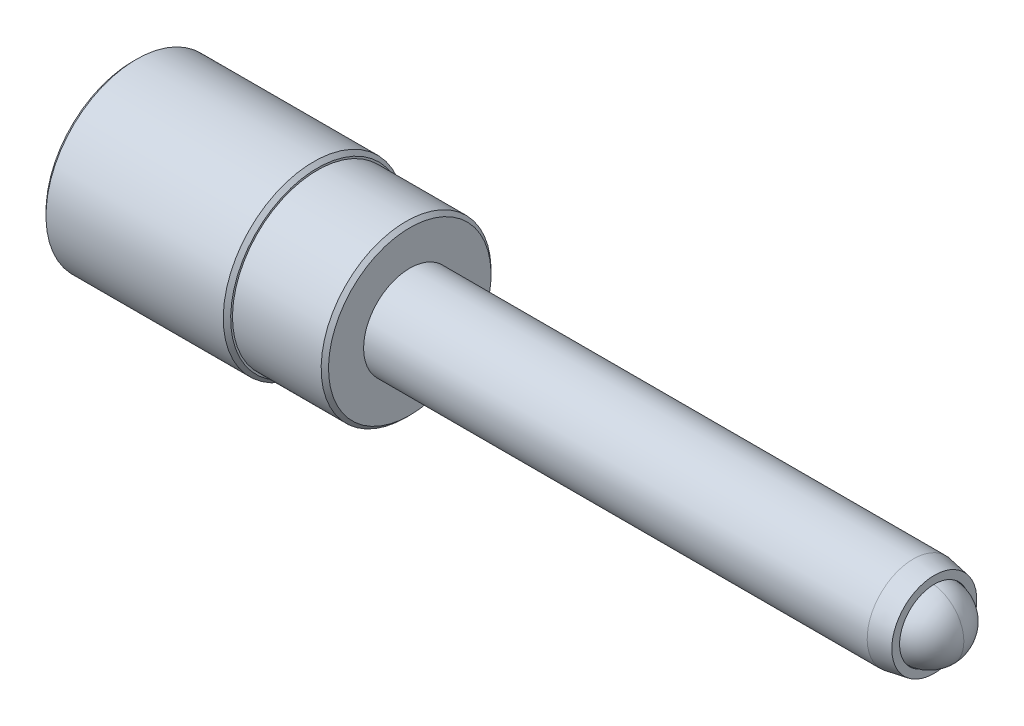
ISO-10303-21;
HEADER;
FILE_DESCRIPTION(('STEP AP214'),'2;1');
FILE_NAME('part.step','',(''),(''),'','','');
FILE_SCHEMA(('AUTOMOTIVE_DESIGN { 1 0 10303 214 1 1 1 1 }'));
ENDSEC;
DATA;
#1=APPLICATION_CONTEXT('core data for automotive mechanical design processes');
#2=APPLICATION_PROTOCOL_DEFINITION('international standard','automotive_design',2000,#1);
#3=PRODUCT_CONTEXT('',#1,'mechanical');
#4=PRODUCT('Part','Part','',(#3));
#5=PRODUCT_RELATED_PRODUCT_CATEGORY('part','',(#4));
#6=PRODUCT_DEFINITION_FORMATION('','',#4);
#7=PRODUCT_DEFINITION_CONTEXT('part definition',#1,'design');
#8=PRODUCT_DEFINITION('design','',#6,#7);
#9=PRODUCT_DEFINITION_SHAPE('','',#8);
#10=(LENGTH_UNIT() NAMED_UNIT(*) SI_UNIT(.MILLI.,.METRE.));
#11=(NAMED_UNIT(*) PLANE_ANGLE_UNIT() SI_UNIT($,.RADIAN.));
#12=(NAMED_UNIT(*) SI_UNIT($,.STERADIAN.) SOLID_ANGLE_UNIT());
#13=UNCERTAINTY_MEASURE_WITH_UNIT(LENGTH_MEASURE(1.E-05),#10,'distance_accuracy_value','');
#14=(GEOMETRIC_REPRESENTATION_CONTEXT(3) GLOBAL_UNCERTAINTY_ASSIGNED_CONTEXT((#13)) GLOBAL_UNIT_ASSIGNED_CONTEXT((#10,
#11,#12)) REPRESENTATION_CONTEXT('',''));
#15=CARTESIAN_POINT('',(0.,0.,0.));
#16=DIRECTION('',(0.,0.,1.));
#17=DIRECTION('',(1.,0.,0.));
#18=AXIS2_PLACEMENT_3D('',#15,#16,#17);
#19=CARTESIAN_POINT('',(-27.596795063286,1.19237132949041,-6.190904680416));
#20=DIRECTION('',(-0.898555667364288,0.394252384271372,0.192776477153873));
#21=DIRECTION('',(-0.186978583481269,-0.741325509164933,0.644573889310365));
#22=AXIS2_PLACEMENT_3D('',#19,#20,#21);
#23=SPHERICAL_SURFACE('',#22,1.190625);
#24=CARTESIAN_POINT('',(-28.6666379047416,1.66177807451351,-5.96138018730467));
#25=VERTEX_POINT('',#24);
#26=VERTEX_LOOP('',#25);
#27=FACE_BOUND('',#26,.T.);
#28=ADVANCED_FACE('P0_F12',(#27),#23,.T.);
#29=CLOSED_SHELL('',(#28));
#30=MANIFOLD_SOLID_BREP('P0_B1',#29);
#31=CARTESIAN_POINT('',(-28.787420063286,1.58320286749359,-2.10278836630096));
#32=DIRECTION('',(-1.,0.,0.));
#33=DIRECTION('',(0.,0.0900550814628505,0.995936786298568));
#34=AXIS2_PLACEMENT_3D('',#31,#32,#33);
#35=PLANE('',#34);
#36=CARTESIAN_POINT('',(-28.787420063286,1.58320286749359,-2.10278836630096));
#37=DIRECTION('',(-1.,0.,0.));
#38=DIRECTION('',(0.,0.0900550814628505,0.995936786298568));
#39=AXIS2_PLACEMENT_3D('',#36,#37,#38);
#40=CIRCLE('',#39,5.96899999999999);
#41=CARTESIAN_POINT('',(-28.787420063286,2.12074164874534,3.84195831111519));
#42=VERTEX_POINT('',#41);
#43=EDGE_CURVE('P1_E29',#42,#42,#40,.T.);
#44=ORIENTED_EDGE('',*,*,#43,.T.);
#45=EDGE_LOOP('',(#44));
#46=FACE_BOUND('',#45,.T.);
#47=CARTESIAN_POINT('',(-28.787420063286,1.21721901642857,-6.15027546581834));
#48=DIRECTION('',(-1.,0.,0.));
#49=DIRECTION('',(0.,0.0900550814628505,0.995936786298568));
#50=AXIS2_PLACEMENT_3D('',#47,#48,#49);
#51=CIRCLE('',#50,1.143);
#52=CARTESIAN_POINT('',(-28.787420063286,1.3201519745406,-5.01191971907907));
#53=VERTEX_POINT('',#52);
#54=EDGE_CURVE('P1_E56',#53,#53,#51,.T.);
#55=ORIENTED_EDGE('',*,*,#54,.F.);
#56=EDGE_LOOP('',(#55));
#57=FACE_BOUND('',#56,.T.);
#58=ADVANCED_FACE('P1_F14',(#46,#57),#35,.T.);
#59=CARTESIAN_POINT('',(-9.73742006328601,1.58320286749359,-2.10278836630096));
#60=DIRECTION('',(1.,0.,0.));
#61=DIRECTION('',(0.,-0.0900550814628505,-0.995936786298568));
#62=AXIS2_PLACEMENT_3D('',#59,#60,#61);
#63=CYLINDRICAL_SURFACE('',#62,6.223);
#64=CARTESIAN_POINT('',(-28.533420063286,1.58320286749359,-2.10278836630096));
#65=DIRECTION('',(-1.,0.,0.));
#66=DIRECTION('',(0.,0.0900550814628505,0.995936786298568));
#67=AXIS2_PLACEMENT_3D('',#64,#65,#66);
#68=CIRCLE('',#67,6.223);
#69=CARTESIAN_POINT('',(-28.533420063286,2.14361563943691,4.09492625483503));
#70=VERTEX_POINT('',#69);
#71=EDGE_CURVE('P1_E34',#70,#70,#68,.F.);
#72=ORIENTED_EDGE('',*,*,#71,.T.);
#73=EDGE_LOOP('',(#72));
#74=FACE_BOUND('',#73,.T.);
#75=CARTESIAN_POINT('',(-16.341420063286,1.58320286749359,-2.10278836630096));
#76=DIRECTION('',(1.,0.,0.));
#77=DIRECTION('',(0.,-0.0900550814628505,-0.995936786298568));
#78=AXIS2_PLACEMENT_3D('',#75,#76,#77);
#79=CIRCLE('',#78,6.223);
#80=CARTESIAN_POINT('',(-16.341420063286,1.02279009555027,-8.30050298743694));
#81=VERTEX_POINT('',#80);
#82=EDGE_CURVE('P1_E37',#81,#81,#79,.F.);
#83=ORIENTED_EDGE('',*,*,#82,.T.);
#84=EDGE_LOOP('',(#83));
#85=FACE_BOUND('',#84,.T.);
#86=ADVANCED_FACE('P1_F72',(#74,#85),#63,.T.);
#87=CARTESIAN_POINT('',(-16.087420063286,1.02279009555027,-8.30050298743694));
#88=DIRECTION('',(1.,0.,0.));
#89=DIRECTION('',(0.,-0.0900550814628505,-0.995936786298568));
#90=AXIS2_PLACEMENT_3D('',#87,#88,#89);
#91=PLANE('',#90);
#92=CARTESIAN_POINT('',(-16.087420063286,1.58320286749359,-2.10278836630096));
#93=DIRECTION('',(1.,0.,0.));
#94=DIRECTION('',(0.,-0.0900550814628505,-0.995936786298568));
#95=AXIS2_PLACEMENT_3D('',#92,#93,#94);
#96=CIRCLE('',#95,5.969);
#97=CARTESIAN_POINT('',(-16.087420063286,1.04566408624183,-8.0475350437171));
#98=VERTEX_POINT('',#97);
#99=EDGE_CURVE('P1_E10',#98,#98,#96,.T.);
#100=ORIENTED_EDGE('',*,*,#99,.T.);
#101=EDGE_LOOP('',(#100));
#102=FACE_BOUND('',#101,.T.);
#103=CARTESIAN_POINT('',(-16.087420063286,1.58320286749359,-2.10278836630096));
#104=DIRECTION('',(1.,0.,0.));
#105=DIRECTION('',(0.,-0.0900550814628505,-0.995936786298568));
#106=AXIS2_PLACEMENT_3D('',#103,#104,#105);
#107=CIRCLE('',#106,5.842);
#108=CARTESIAN_POINT('',(-16.087420063286,1.05710108158762,-7.92105107185719));
#109=VERTEX_POINT('',#108);
#110=EDGE_CURVE('P1_E40',#109,#109,#107,.T.);
#111=ORIENTED_EDGE('',*,*,#110,.F.);
#112=EDGE_LOOP('',(#111));
#113=FACE_BOUND('',#112,.T.);
#114=ADVANCED_FACE('P1_F79',(#102,#113),#91,.T.);
#115=CARTESIAN_POINT('',(-9.73742006328601,1.58320286749359,-2.10278836630096));
#116=DIRECTION('',(1.,0.,0.));
#117=DIRECTION('',(0.,-0.0900550814628505,-0.995936786298568));
#118=AXIS2_PLACEMENT_3D('',#115,#116,#117);
#119=CYLINDRICAL_SURFACE('',#118,5.842);
#120=CARTESIAN_POINT('',(-9.99142006328602,1.58320286749359,-2.10278836630096));
#121=DIRECTION('',(1.,0.,0.));
#122=DIRECTION('',(0.,-0.0900550814628505,-0.995936786298568));
#123=AXIS2_PLACEMENT_3D('',#120,#121,#122);
#124=CIRCLE('',#123,5.842);
#125=CARTESIAN_POINT('',(-9.99142006328602,1.05710108158762,-7.92105107185719));
#126=VERTEX_POINT('',#125);
#127=EDGE_CURVE('P1_E21',#126,#126,#124,.F.);
#128=ORIENTED_EDGE('',*,*,#127,.T.);
#129=EDGE_LOOP('',(#128));
#130=FACE_BOUND('',#129,.T.);
#131=ORIENTED_EDGE('',*,*,#110,.T.);
#132=EDGE_LOOP('',(#131));
#133=FACE_BOUND('',#132,.T.);
#134=ADVANCED_FACE('P1_F101',(#130,#133),#119,.T.);
#135=CARTESIAN_POINT('',(-9.73742006328601,1.05710108158762,-7.92105107185719));
#136=DIRECTION('',(1.,0.,0.));
#137=DIRECTION('',(0.,-0.0900550814628505,-0.995936786298568));
#138=AXIS2_PLACEMENT_3D('',#135,#136,#137);
#139=PLANE('',#138);
#140=CARTESIAN_POINT('',(-9.73742006328601,1.58320286749359,-2.10278836630096));
#141=DIRECTION('',(1.,0.,0.));
#142=DIRECTION('',(0.,-0.0900550814628505,-0.995936786298568));
#143=AXIS2_PLACEMENT_3D('',#140,#141,#142);
#144=CIRCLE('',#143,5.588);
#145=CARTESIAN_POINT('',(-9.73742006328601,1.07997507227918,-7.66808312813736));
#146=VERTEX_POINT('',#145);
#147=EDGE_CURVE('P1_E25',#146,#146,#144,.T.);
#148=ORIENTED_EDGE('',*,*,#147,.T.);
#149=EDGE_LOOP('',(#148));
#150=FACE_BOUND('',#149,.T.);
#151=CARTESIAN_POINT('',(-9.73742006328601,1.58320286749359,-2.10278836630096));
#152=DIRECTION('',(1.,0.,0.));
#153=DIRECTION('',(0.,-0.0900550814628505,-0.995936786298568));
#154=AXIS2_PLACEMENT_3D('',#151,#152,#153);
#155=CIRCLE('',#154,3.1496);
#156=CARTESIAN_POINT('',(-9.73742006328601,1.29956538291819,-5.23959086842693));
#157=VERTEX_POINT('',#156);
#158=EDGE_CURVE('P1_E50',#157,#157,#155,.T.);
#159=ORIENTED_EDGE('',*,*,#158,.F.);
#160=EDGE_LOOP('',(#159));
#161=FACE_BOUND('',#160,.T.);
#162=ADVANCED_FACE('P1_F97',(#150,#161),#139,.T.);
#163=CARTESIAN_POINT('',(-15.833420063286,1.58320286749359,-2.10278836630096));
#164=DIRECTION('',(1.,0.,0.));
#165=DIRECTION('',(0.,-0.0900550814628505,-0.995936786298568));
#166=AXIS2_PLACEMENT_3D('',#163,#164,#165);
#167=PLANE('',#166);
#168=CARTESIAN_POINT('',(-15.833420063286,1.58320286749359,-2.10278836630096));
#169=DIRECTION('',(1.,0.,0.));
#170=DIRECTION('',(0.,-0.0900550814628505,-0.995936786298568));
#171=AXIS2_PLACEMENT_3D('',#168,#169,#170);
#172=CIRCLE('',#171,3.1496);
#173=CARTESIAN_POINT('',(-15.833420063286,1.29956538291819,-5.23959086842693));
#174=VERTEX_POINT('',#173);
#175=EDGE_CURVE('P1_E45',#174,#174,#172,.T.);
#176=ORIENTED_EDGE('',*,*,#175,.T.);
#177=EDGE_LOOP('',(#176));
#178=FACE_BOUND('',#177,.T.);
#179=CARTESIAN_POINT('',(-15.833420063286,1.58320286749359,-2.10278836630096));
#180=DIRECTION('',(1.,0.,0.));
#181=DIRECTION('',(0.,-0.0900550814628505,-0.995936786298568));
#182=AXIS2_PLACEMENT_3D('',#179,#180,#181);
#183=CIRCLE('',#182,2.9718);
#184=CARTESIAN_POINT('',(-15.833420063286,1.31557717640229,-5.06251330782304));
#185=VERTEX_POINT('',#184);
#186=EDGE_CURVE('P1_E41',#185,#185,#183,.F.);
#187=ORIENTED_EDGE('',*,*,#186,.T.);
#188=EDGE_LOOP('',(#187));
#189=FACE_BOUND('',#188,.T.);
#190=ADVANCED_FACE('P1_F100',(#178,#189),#167,.T.);
#191=CARTESIAN_POINT('',(-15.833420063286,1.58320286749359,-2.10278836630096));
#192=DIRECTION('',(1.,0.,0.));
#193=DIRECTION('',(0.,-0.0900550814628505,-0.995936786298568));
#194=AXIS2_PLACEMENT_3D('',#191,#192,#193);
#195=CYLINDRICAL_SURFACE('',#194,3.1496);
#196=CARTESIAN_POINT('',(-15.833420063286,1.29956538291819,-5.23959086842693));
#197=CARTESIAN_POINT('',(-15.769920063286,1.29956538291819,-5.23959086842693));
#198=CARTESIAN_POINT('',(-15.706420063286,1.29956538291819,-5.23959086842693));
#199=CARTESIAN_POINT('',(-15.579420063286,1.29956538291819,-5.23959086842693));
#200=CARTESIAN_POINT('',(-15.515920063286,1.29956538291819,-5.23959086842693));
#201=CARTESIAN_POINT('',(-15.388920063286,1.29956538291819,-5.23959086842693));
#202=CARTESIAN_POINT('',(-15.325420063286,1.29956538291819,-5.23959086842693));
#203=CARTESIAN_POINT('',(-15.198420063286,1.29956538291819,-5.23959086842693));
#204=CARTESIAN_POINT('',(-15.134920063286,1.29956538291819,-5.23959086842693));
#205=CARTESIAN_POINT('',(-15.007920063286,1.29956538291819,-5.23959086842693));
#206=CARTESIAN_POINT('',(-14.944420063286,1.29956538291819,-5.23959086842693));
#207=CARTESIAN_POINT('',(-14.817420063286,1.29956538291819,-5.23959086842693));
#208=CARTESIAN_POINT('',(-14.753920063286,1.29956538291819,-5.23959086842693));
#209=CARTESIAN_POINT('',(-14.626920063286,1.29956538291819,-5.23959086842693));
#210=CARTESIAN_POINT('',(-14.563420063286,1.29956538291819,-5.23959086842693));
#211=CARTESIAN_POINT('',(-14.436420063286,1.29956538291819,-5.23959086842693));
#212=CARTESIAN_POINT('',(-14.372920063286,1.29956538291819,-5.23959086842693));
#213=CARTESIAN_POINT('',(-14.245920063286,1.29956538291819,-5.23959086842693));
#214=CARTESIAN_POINT('',(-14.182420063286,1.29956538291819,-5.23959086842693));
#215=CARTESIAN_POINT('',(-14.055420063286,1.29956538291819,-5.23959086842693));
#216=CARTESIAN_POINT('',(-13.991920063286,1.29956538291819,-5.23959086842693));
#217=CARTESIAN_POINT('',(-13.864920063286,1.29956538291819,-5.23959086842693));
#218=CARTESIAN_POINT('',(-13.801420063286,1.29956538291819,-5.23959086842693));
#219=CARTESIAN_POINT('',(-13.674420063286,1.29956538291819,-5.23959086842693));
#220=CARTESIAN_POINT('',(-13.610920063286,1.29956538291819,-5.23959086842693));
#221=CARTESIAN_POINT('',(-13.483920063286,1.29956538291819,-5.23959086842693));
#222=CARTESIAN_POINT('',(-13.420420063286,1.29956538291819,-5.23959086842693));
#223=CARTESIAN_POINT('',(-13.293420063286,1.29956538291819,-5.23959086842693));
#224=CARTESIAN_POINT('',(-13.229920063286,1.29956538291819,-5.23959086842693));
#225=CARTESIAN_POINT('',(-13.102920063286,1.29956538291819,-5.23959086842693));
#226=CARTESIAN_POINT('',(-13.039420063286,1.29956538291819,-5.23959086842693));
#227=CARTESIAN_POINT('',(-12.912420063286,1.29956538291819,-5.23959086842693));
#228=CARTESIAN_POINT('',(-12.848920063286,1.29956538291819,-5.23959086842693));
#229=CARTESIAN_POINT('',(-12.721920063286,1.29956538291819,-5.23959086842693));
#230=CARTESIAN_POINT('',(-12.658420063286,1.29956538291819,-5.23959086842693));
#231=CARTESIAN_POINT('',(-12.531420063286,1.29956538291819,-5.23959086842693));
#232=CARTESIAN_POINT('',(-12.467920063286,1.29956538291819,-5.23959086842693));
#233=CARTESIAN_POINT('',(-12.340920063286,1.29956538291819,-5.23959086842693));
#234=CARTESIAN_POINT('',(-12.277420063286,1.29956538291819,-5.23959086842693));
#235=CARTESIAN_POINT('',(-12.150420063286,1.29956538291819,-5.23959086842693));
#236=CARTESIAN_POINT('',(-12.086920063286,1.29956538291819,-5.23959086842693));
#237=CARTESIAN_POINT('',(-11.959920063286,1.29956538291819,-5.23959086842693));
#238=CARTESIAN_POINT('',(-11.896420063286,1.29956538291819,-5.23959086842693));
#239=CARTESIAN_POINT('',(-11.769420063286,1.29956538291819,-5.23959086842693));
#240=CARTESIAN_POINT('',(-11.705920063286,1.29956538291819,-5.23959086842693));
#241=CARTESIAN_POINT('',(-11.578920063286,1.29956538291819,-5.23959086842693));
#242=CARTESIAN_POINT('',(-11.515420063286,1.29956538291819,-5.23959086842693));
#243=CARTESIAN_POINT('',(-11.388420063286,1.29956538291819,-5.23959086842693));
#244=CARTESIAN_POINT('',(-11.324920063286,1.29956538291819,-5.23959086842693));
#245=CARTESIAN_POINT('',(-11.197920063286,1.29956538291819,-5.23959086842693));
#246=CARTESIAN_POINT('',(-11.134420063286,1.29956538291819,-5.23959086842693));
#247=CARTESIAN_POINT('',(-11.007420063286,1.29956538291819,-5.23959086842693));
#248=CARTESIAN_POINT('',(-10.943920063286,1.29956538291819,-5.23959086842693));
#249=CARTESIAN_POINT('',(-10.816920063286,1.29956538291819,-5.23959086842693));
#250=CARTESIAN_POINT('',(-10.753420063286,1.29956538291819,-5.23959086842693));
#251=CARTESIAN_POINT('',(-10.626420063286,1.29956538291819,-5.23959086842693));
#252=CARTESIAN_POINT('',(-10.562920063286,1.29956538291819,-5.23959086842693));
#253=CARTESIAN_POINT('',(-10.435920063286,1.29956538291819,-5.23959086842693));
#254=CARTESIAN_POINT('',(-10.372420063286,1.29956538291819,-5.23959086842693));
#255=CARTESIAN_POINT('',(-10.245420063286,1.29956538291819,-5.23959086842693));
#256=CARTESIAN_POINT('',(-10.181920063286,1.29956538291819,-5.23959086842693));
#257=CARTESIAN_POINT('',(-10.054920063286,1.29956538291819,-5.23959086842693));
#258=CARTESIAN_POINT('',(-9.99142006328602,1.29956538291819,-5.23959086842693));
#259=CARTESIAN_POINT('',(-9.86442006328602,1.29956538291819,-5.23959086842693));
#260=CARTESIAN_POINT('',(-9.80092006328601,1.29956538291819,-5.23959086842693));
#261=CARTESIAN_POINT('',(-9.73742006328601,1.29956538291819,-5.23959086842693));
#262=B_SPLINE_CURVE_WITH_KNOTS('',3,(#196,#197,#198,#199,#200,#201,#202,#203,#204,#205,#206,
#207,#208,#209,#210,#211,#212,#213,#214,#215,#216,#217,#218,#219,#220,#221,#222,#223,#224,#225,
#226,#227,#228,#229,#230,#231,#232,#233,#234,#235,#236,#237,#238,#239,#240,#241,#242,#243,#244,
#245,#246,#247,#248,#249,#250,#251,#252,#253,#254,#255,#256,#257,#258,#259,#260,#261),
.UNSPECIFIED.,.F.,.F.,(4,2,2,2,2,2,2,2,2,2,2,2,2,2,2,2,2,2,2,2,2,2,2,2,2,2,2,2,2,2,2,2,4),(0.,
0.190500000000003,0.381000000000001,0.571500000000003,0.762000000000002,0.952500000000002,1.143,
1.3335,1.524,1.7145,1.905,2.0955,2.286,2.4765,2.667,2.8575,3.048,3.2385,3.429,3.6195,3.81,
4.0005,4.191,4.3815,4.572,4.7625,4.953,5.1435,5.334,5.5245,5.715,5.9055,6.096),.UNSPECIFIED.);
#263=EDGE_CURVE('P1_BSEAM105',#174,#157,#262,.T.);
#264=ORIENTED_EDGE('',*,*,#175,.F.);
#265=ORIENTED_EDGE('',*,*,#158,.T.);
#266=ORIENTED_EDGE('',*,*,#263,.T.);
#267=ORIENTED_EDGE('',*,*,#263,.F.);
#268=EDGE_LOOP('',(#264,#266,#265,#267));
#269=FACE_BOUND('',#268,.T.);
#270=ADVANCED_FACE('P1_F105',(#269),#195,.F.);
#271=CARTESIAN_POINT('',(-22.437420063286,1.58320286749359,-2.10278836630096));
#272=DIRECTION('',(1.,0.,0.));
#273=DIRECTION('',(0.,-0.0900550814628505,-0.995936786298568));
#274=AXIS2_PLACEMENT_3D('',#271,#272,#273);
#275=PLANE('',#274);
#276=CARTESIAN_POINT('',(-22.437420063286,1.58320286749359,-2.10278836630096));
#277=DIRECTION('',(1.,0.,0.));
#278=DIRECTION('',(0.,-0.0900550814628505,-0.995936786298568));
#279=AXIS2_PLACEMENT_3D('',#276,#277,#278);
#280=CIRCLE('',#279,2.9718);
#281=CARTESIAN_POINT('',(-22.437420063286,1.31557717640229,-5.06251330782304));
#282=VERTEX_POINT('',#281);
#283=EDGE_CURVE('P1_E44',#282,#282,#280,.T.);
#284=ORIENTED_EDGE('',*,*,#283,.T.);
#285=EDGE_LOOP('',(#284));
#286=FACE_BOUND('',#285,.T.);
#287=ADVANCED_FACE('P1_F107',(#286),#275,.T.);
#288=CARTESIAN_POINT('',(-22.437420063286,1.58320286749359,-2.10278836630096));
#289=DIRECTION('',(1.,0.,0.));
#290=DIRECTION('',(0.,-0.0900550814628505,-0.995936786298568));
#291=AXIS2_PLACEMENT_3D('',#288,#289,#290);
#292=CYLINDRICAL_SURFACE('',#291,2.9718);
#293=ORIENTED_EDGE('',*,*,#283,.F.);
#294=EDGE_LOOP('',(#293));
#295=FACE_BOUND('',#294,.T.);
#296=ORIENTED_EDGE('',*,*,#186,.F.);
#297=EDGE_LOOP('',(#296));
#298=FACE_BOUND('',#297,.T.);
#299=ADVANCED_FACE('P1_F67',(#295,#298),#292,.F.);
#300=CARTESIAN_POINT('',(-26.501420063286,1.21721901642857,-6.15027546581834));
#301=DIRECTION('',(-1.,0.,0.));
#302=DIRECTION('',(0.,0.0900550814628505,0.995936786298568));
#303=AXIS2_PLACEMENT_3D('',#300,#301,#302);
#304=CYLINDRICAL_SURFACE('',#303,1.143);
#305=CARTESIAN_POINT('',(-26.501420063286,1.21721901642857,-6.15027546581834));
#306=DIRECTION('',(-1.,0.,0.));
#307=DIRECTION('',(0.,0.0900550814628505,0.995936786298568));
#308=AXIS2_PLACEMENT_3D('',#305,#306,#307);
#309=CIRCLE('',#308,1.143);
#310=CARTESIAN_POINT('',(-26.501420063286,1.3201519745406,-5.01191971907907));
#311=VERTEX_POINT('',#310);
#312=EDGE_CURVE('P1_E53',#311,#311,#309,.T.);
#313=ORIENTED_EDGE('',*,*,#312,.F.);
#314=EDGE_LOOP('',(#313));
#315=FACE_BOUND('',#314,.T.);
#316=ORIENTED_EDGE('',*,*,#54,.T.);
#317=EDGE_LOOP('',(#316));
#318=FACE_BOUND('',#317,.T.);
#319=ADVANCED_FACE('P1_F64',(#315,#318),#304,.F.);
#320=CARTESIAN_POINT('',(-26.501420063286,1.21721901642857,-6.15027546581834));
#321=DIRECTION('',(-1.,0.,0.));
#322=DIRECTION('',(0.,0.0900550814628505,0.995936786298568));
#323=AXIS2_PLACEMENT_3D('',#320,#321,#322);
#324=PLANE('',#323);
#325=ORIENTED_EDGE('',*,*,#312,.T.);
#326=EDGE_LOOP('',(#325));
#327=FACE_BOUND('',#326,.T.);
#328=ADVANCED_FACE('P1_F62',(#327),#324,.T.);
#329=CARTESIAN_POINT('',(-28.533420063286,1.58320286749359,-2.10278836630096));
#330=DIRECTION('',(1.,0.,0.));
#331=DIRECTION('',(0.,-0.0900550814628505,-0.995936786298568));
#332=AXIS2_PLACEMENT_3D('',#329,#330,#331);
#333=CONICAL_SURFACE('',#332,6.223,0.78539816339745);
#334=ORIENTED_EDGE('',*,*,#43,.F.);
#335=EDGE_LOOP('',(#334));
#336=FACE_BOUND('',#335,.T.);
#337=ORIENTED_EDGE('',*,*,#71,.F.);
#338=EDGE_LOOP('',(#337));
#339=FACE_BOUND('',#338,.T.);
#340=ADVANCED_FACE('P1_F84',(#336,#339),#333,.T.);
#341=CARTESIAN_POINT('',(-9.73742006328601,1.58320286749359,-2.10278836630096));
#342=DIRECTION('',(-1.,0.,0.));
#343=DIRECTION('',(0.,0.0900550814628505,0.995936786298568));
#344=AXIS2_PLACEMENT_3D('',#341,#342,#343);
#345=CONICAL_SURFACE('',#344,5.588,0.785398163397443);
#346=ORIENTED_EDGE('',*,*,#127,.F.);
#347=EDGE_LOOP('',(#346));
#348=FACE_BOUND('',#347,.T.);
#349=ORIENTED_EDGE('',*,*,#147,.F.);
#350=EDGE_LOOP('',(#349));
#351=FACE_BOUND('',#350,.T.);
#352=ADVANCED_FACE('P1_F86',(#348,#351),#345,.T.);
#353=CARTESIAN_POINT('',(-16.087420063286,1.58320286749359,-2.10278836630096));
#354=DIRECTION('',(-1.,0.,0.));
#355=DIRECTION('',(0.,0.0900550814628505,0.995936786298568));
#356=AXIS2_PLACEMENT_3D('',#353,#354,#355);
#357=CONICAL_SURFACE('',#356,5.969,0.785398163397447);
#358=ORIENTED_EDGE('',*,*,#82,.F.);
#359=EDGE_LOOP('',(#358));
#360=FACE_BOUND('',#359,.T.);
#361=ORIENTED_EDGE('',*,*,#99,.F.);
#362=EDGE_LOOP('',(#361));
#363=FACE_BOUND('',#362,.T.);
#364=ADVANCED_FACE('P1_F16',(#360,#363),#357,.T.);
#365=CLOSED_SHELL('',(#58,#86,#114,#134,#162,#190,#270,#287,#299,#319,#328,#340,#352,#364));
#366=MANIFOLD_SOLID_BREP('P1_B1',#365);
#367=CARTESIAN_POINT('',(25.981329936714,1.58320286749358,-2.10278836630096));
#368=DIRECTION('',(-1.,0.,0.));
#369=DIRECTION('',(0.,1.,0.));
#370=AXIS2_PLACEMENT_3D('',#367,#368,#369);
#371=SPHERICAL_SURFACE('',#370,2.38125);
#372=CARTESIAN_POINT('',(25.981329936714,1.58320286749358,-2.10278836630096));
#373=DIRECTION('',(0.,0.,1.));
#374=DIRECTION('',(0.,1.,0.));
#375=AXIS2_PLACEMENT_3D('',#372,#373,#374);
#376=CIRCLE('',#375,2.38125);
#377=CARTESIAN_POINT('',(25.981329936714,3.96445286749358,-2.10278836630096));
#378=VERTEX_POINT('',#377);
#379=CARTESIAN_POINT('',(25.981329936714,-0.798047132506418,-2.10278836630096));
#380=VERTEX_POINT('',#379);
#381=EDGE_CURVE('P2_E33',#378,#380,#376,.T.);
#382=ORIENTED_EDGE('',*,*,#381,.T.);
#383=CARTESIAN_POINT('',(25.981329936714,1.58320286749358,-2.10278836630096));
#384=DIRECTION('',(-1.,0.,0.));
#385=DIRECTION('',(0.,0.,1.));
#386=AXIS2_PLACEMENT_3D('',#383,#384,#385);
#387=CIRCLE('',#386,2.38125);
#388=EDGE_CURVE('P2_E11',#380,#378,#387,.T.);
#389=ORIENTED_EDGE('',*,*,#388,.T.);
#390=EDGE_LOOP('',(#382,#389));
#391=FACE_BOUND('',#390,.T.);
#392=ADVANCED_FACE('P2_F16',(#391),#371,.T.);
#393=ORIENTED_EDGE('',*,*,#381,.F.);
#394=CARTESIAN_POINT('',(25.981329936714,1.58320286749358,-2.10278836630096));
#395=DIRECTION('',(-1.,0.,0.));
#396=DIRECTION('',(0.,0.,1.));
#397=AXIS2_PLACEMENT_3D('',#394,#395,#396);
#398=CIRCLE('',#397,2.38125);
#399=EDGE_CURVE('P2_E23',#378,#380,#398,.T.);
#400=ORIENTED_EDGE('',*,*,#399,.T.);
#401=EDGE_LOOP('',(#393,#400));
#402=FACE_BOUND('',#401,.T.);
#403=ADVANCED_FACE('P2_F40',(#402),#371,.T.);
#404=ORIENTED_EDGE('',*,*,#388,.F.);
#405=EDGE_CURVE('P2_E36',#380,#378,#376,.T.);
#406=ORIENTED_EDGE('',*,*,#405,.T.);
#407=EDGE_LOOP('',(#404,#406));
#408=FACE_BOUND('',#407,.T.);
#409=ADVANCED_FACE('P2_F38',(#408),#371,.T.);
#410=ORIENTED_EDGE('',*,*,#399,.F.);
#411=ORIENTED_EDGE('',*,*,#405,.F.);
#412=EDGE_LOOP('',(#410,#411));
#413=FACE_BOUND('',#412,.T.);
#414=ADVANCED_FACE('P2_F18',(#413),#371,.T.);
#415=CLOSED_SHELL('',(#392,#403,#409,#414));
#416=MANIFOLD_SOLID_BREP('P2_B1',#415);
#417=CARTESIAN_POINT('',(-22.437420063286,1.58320286749358,-2.10278836630096));
#418=DIRECTION('',(-1.,0.,0.));
#419=DIRECTION('',(0.,-1.,0.));
#420=AXIS2_PLACEMENT_3D('',#417,#418,#419);
#421=PLANE('',#420);
#422=CARTESIAN_POINT('',(-22.437420063286,1.58320286749358,-2.10278836630096));
#423=DIRECTION('',(1.,0.,0.));
#424=DIRECTION('',(0.,1.,0.));
#425=AXIS2_PLACEMENT_3D('',#422,#423,#424);
#426=CIRCLE('',#425,2.921);
#427=CARTESIAN_POINT('',(-22.437420063286,4.50420286749358,-2.10278836630096));
#428=VERTEX_POINT('',#427);
#429=EDGE_CURVE('P3_E11',#428,#428,#426,.T.);
#430=ORIENTED_EDGE('',*,*,#429,.F.);
#431=EDGE_LOOP('',(#430));
#432=FACE_BOUND('',#431,.T.);
#433=ADVANCED_FACE('P3_F16',(#432),#421,.T.);
#434=CARTESIAN_POINT('',(-22.183420063286,1.58320286749358,-2.10278836630096));
#435=DIRECTION('',(1.,0.,0.));
#436=DIRECTION('',(0.,1.,0.));
#437=AXIS2_PLACEMENT_3D('',#434,#435,#436);
#438=CONICAL_SURFACE('',#437,3.175,0.785398163397453);
#439=ORIENTED_EDGE('',*,*,#429,.T.);
#440=EDGE_LOOP('',(#439));
#441=FACE_BOUND('',#440,.T.);
#442=CARTESIAN_POINT('',(-22.183420063286,1.58320286749358,-2.10278836630096));
#443=DIRECTION('',(1.,0.,0.));
#444=DIRECTION('',(0.,1.,0.));
#445=AXIS2_PLACEMENT_3D('',#442,#443,#444);
#446=CIRCLE('',#445,3.175);
#447=CARTESIAN_POINT('',(-22.183420063286,4.75820286749358,-2.10278836630096));
#448=VERTEX_POINT('',#447);
#449=EDGE_CURVE('P3_E22',#448,#448,#446,.T.);
#450=ORIENTED_EDGE('',*,*,#449,.F.);
#451=EDGE_LOOP('',(#450));
#452=FACE_BOUND('',#451,.T.);
#453=ADVANCED_FACE('P3_F39',(#441,#452),#438,.T.);
#454=CARTESIAN_POINT('',(22.6137338913131,1.58320286749359,-2.10278836630096));
#455=DIRECTION('',(1.,0.,0.));
#456=DIRECTION('',(0.,1.,0.));
#457=AXIS2_PLACEMENT_3D('',#454,#455,#456);
#458=CYLINDRICAL_SURFACE('',#457,3.175);
#459=ORIENTED_EDGE('',*,*,#449,.T.);
#460=EDGE_LOOP('',(#459));
#461=FACE_BOUND('',#460,.T.);
#462=CARTESIAN_POINT('',(24.8900743545311,1.58320286749359,-2.10278836630096));
#463=DIRECTION('',(1.,0.,0.));
#464=DIRECTION('',(0.,1.,0.));
#465=AXIS2_PLACEMENT_3D('',#462,#463,#464);
#466=CIRCLE('',#465,3.17499999999999);
#467=CARTESIAN_POINT('',(24.8900743545311,4.75820286749358,-2.10278836630096));
#468=VERTEX_POINT('',#467);
#469=EDGE_CURVE('P3_E51',#468,#468,#466,.T.);
#470=ORIENTED_EDGE('',*,*,#469,.F.);
#471=EDGE_LOOP('',(#470));
#472=FACE_BOUND('',#471,.T.);
#473=ADVANCED_FACE('P3_F44',(#461,#472),#458,.T.);
#474=CARTESIAN_POINT('',(26.330579936714,1.58320286749359,-2.10278836630096));
#475=DIRECTION('',(-1.,0.,0.));
#476=DIRECTION('',(0.,-1.,0.));
#477=AXIS2_PLACEMENT_3D('',#474,#475,#476);
#478=CONICAL_SURFACE('',#477,2.92099999999999,0.174532925199434);
#479=ORIENTED_EDGE('',*,*,#469,.T.);
#480=EDGE_LOOP('',(#479));
#481=FACE_BOUND('',#480,.T.);
#482=CARTESIAN_POINT('',(26.330579936714,1.58320286749359,-2.10278836630096));
#483=DIRECTION('',(1.,0.,0.));
#484=DIRECTION('',(0.,1.,0.));
#485=AXIS2_PLACEMENT_3D('',#482,#483,#484);
#486=CIRCLE('',#485,2.92099999999999);
#487=CARTESIAN_POINT('',(26.330579936714,4.50420286749358,-2.10278836630096));
#488=VERTEX_POINT('',#487);
#489=EDGE_CURVE('P3_E53',#488,#488,#486,.T.);
#490=ORIENTED_EDGE('',*,*,#489,.F.);
#491=EDGE_LOOP('',(#490));
#492=FACE_BOUND('',#491,.T.);
#493=ADVANCED_FACE('P3_F67',(#481,#492),#478,.T.);
#494=CARTESIAN_POINT('',(26.330579936714,4.50420286749358,-2.10278836630096));
#495=DIRECTION('',(1.,0.,0.));
#496=DIRECTION('',(0.,1.,0.));
#497=AXIS2_PLACEMENT_3D('',#494,#495,#496);
#498=PLANE('',#497);
#499=ORIENTED_EDGE('',*,*,#489,.T.);
#500=EDGE_LOOP('',(#499));
#501=FACE_BOUND('',#500,.T.);
#502=CARTESIAN_POINT('',(26.330579936714,1.58320286749359,-2.10278836630096));
#503=DIRECTION('',(1.,0.,0.));
#504=DIRECTION('',(0.,1.,0.));
#505=AXIS2_PLACEMENT_3D('',#502,#503,#504);
#506=CIRCLE('',#505,2.3876);
#507=CARTESIAN_POINT('',(26.330579936714,3.97080286749359,-2.10278836630096));
#508=VERTEX_POINT('',#507);
#509=EDGE_CURVE('P3_E58',#508,#508,#506,.T.);
#510=ORIENTED_EDGE('',*,*,#509,.F.);
#511=EDGE_LOOP('',(#510));
#512=FACE_BOUND('',#511,.T.);
#513=ADVANCED_FACE('P3_F34',(#501,#512),#498,.T.);
#514=CARTESIAN_POINT('',(22.6137338913131,1.58320286749359,-2.10278836630096));
#515=DIRECTION('',(1.,0.,0.));
#516=DIRECTION('',(0.,1.,0.));
#517=AXIS2_PLACEMENT_3D('',#514,#515,#516);
#518=CYLINDRICAL_SURFACE('',#517,2.3876);
#519=ORIENTED_EDGE('',*,*,#509,.T.);
#520=EDGE_LOOP('',(#519));
#521=FACE_BOUND('',#520,.T.);
#522=CARTESIAN_POINT('',(25.0013338913131,1.58320286749359,-2.10278836630096));
#523=DIRECTION('',(1.,0.,0.));
#524=DIRECTION('',(0.,1.,0.));
#525=AXIS2_PLACEMENT_3D('',#522,#523,#524);
#526=CIRCLE('',#525,2.3876);
#527=CARTESIAN_POINT('',(25.0013338913131,3.97080286749359,-2.10278836630096));
#528=VERTEX_POINT('',#527);
#529=EDGE_CURVE('P3_E61',#528,#528,#526,.T.);
#530=ORIENTED_EDGE('',*,*,#529,.F.);
#531=EDGE_LOOP('',(#530));
#532=FACE_BOUND('',#531,.T.);
#533=ADVANCED_FACE('P3_F27',(#521,#532),#518,.F.);
#534=CARTESIAN_POINT('',(22.6137338913131,1.58320286749359,-2.10278836630096));
#535=DIRECTION('',(1.,0.,0.));
#536=DIRECTION('',(0.,1.,0.));
#537=AXIS2_PLACEMENT_3D('',#534,#535,#536);
#538=CONICAL_SURFACE('',#537,0.,0.78539816339745);
#539=ORIENTED_EDGE('',*,*,#529,.T.);
#540=EDGE_LOOP('',(#539));
#541=FACE_BOUND('',#540,.T.);
#542=CARTESIAN_POINT('',(22.6137338913131,1.58320286749359,-2.10278836630096));
#543=VERTEX_POINT('',#542);
#544=VERTEX_LOOP('',#543);
#545=FACE_BOUND('',#544,.T.);
#546=ADVANCED_FACE('P3_F25',(#541,#545),#538,.F.);
#547=CLOSED_SHELL('',(#433,#453,#473,#493,#513,#533,#546));
#548=MANIFOLD_SOLID_BREP('P3_B1',#547);
#549=ADVANCED_BREP_SHAPE_REPRESENTATION('',(#18,#30,#366,#416,#548),#14);
#550=SHAPE_DEFINITION_REPRESENTATION(#9,#549);
ENDSEC;
END-ISO-10303-21;
